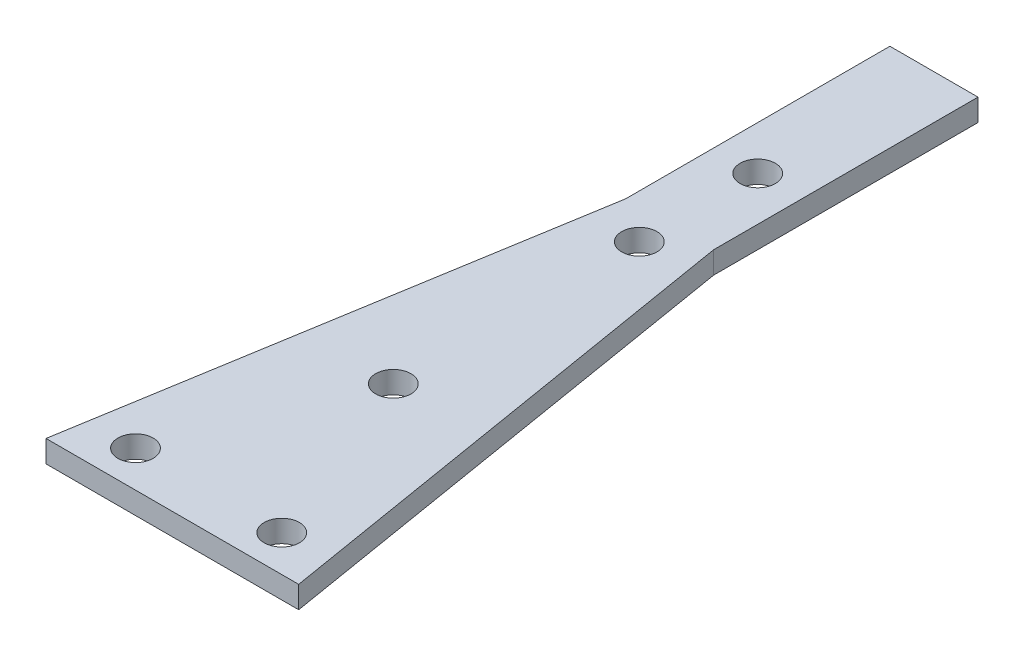
ISO-10303-21;
HEADER;
FILE_DESCRIPTION(('STEP AP214'),'2;1');
FILE_NAME('part.step','',(''),(''),'','','');
FILE_SCHEMA(('AUTOMOTIVE_DESIGN { 1 0 10303 214 1 1 1 1 }'));
ENDSEC;
DATA;
#1=APPLICATION_CONTEXT('core data for automotive mechanical design processes');
#2=APPLICATION_PROTOCOL_DEFINITION('international standard','automotive_design',2000,#1);
#3=PRODUCT_CONTEXT('',#1,'mechanical');
#4=PRODUCT('Part','Part','',(#3));
#5=PRODUCT_RELATED_PRODUCT_CATEGORY('part','',(#4));
#6=PRODUCT_DEFINITION_FORMATION('','',#4);
#7=PRODUCT_DEFINITION_CONTEXT('part definition',#1,'design');
#8=PRODUCT_DEFINITION('design','',#6,#7);
#9=PRODUCT_DEFINITION_SHAPE('','',#8);
#10=(LENGTH_UNIT() NAMED_UNIT(*) SI_UNIT(.MILLI.,.METRE.));
#11=(NAMED_UNIT(*) PLANE_ANGLE_UNIT() SI_UNIT($,.RADIAN.));
#12=(NAMED_UNIT(*) SI_UNIT($,.STERADIAN.) SOLID_ANGLE_UNIT());
#13=UNCERTAINTY_MEASURE_WITH_UNIT(LENGTH_MEASURE(1.E-05),#10,'distance_accuracy_value','');
#14=(GEOMETRIC_REPRESENTATION_CONTEXT(3) GLOBAL_UNCERTAINTY_ASSIGNED_CONTEXT((#13)) GLOBAL_UNIT_ASSIGNED_CONTEXT((#10,
#11,#12)) REPRESENTATION_CONTEXT('',''));
#15=CARTESIAN_POINT('',(0.,0.,0.));
#16=DIRECTION('',(0.,0.,1.));
#17=DIRECTION('',(1.,0.,0.));
#18=AXIS2_PLACEMENT_3D('',#15,#16,#17);
#19=CARTESIAN_POINT('',(0.,3.175,-5.08));
#20=DIRECTION('',(0.,0.,1.));
#21=DIRECTION('',(1.,0.,0.));
#22=AXIS2_PLACEMENT_3D('',#19,#20,#21);
#23=PLANE('',#22);
#24=DIRECTION('',(-1.,0.,0.));
#25=VECTOR('',#24,1.);
#26=CARTESIAN_POINT('',(0.,0.,-5.08));
#27=LINE('',#26,#25);
#28=CARTESIAN_POINT('',(37.2594043022615,0.,-5.08));
#29=VERTEX_POINT('',#28);
#30=CARTESIAN_POINT('',(0.840595697738554,0.,-5.08));
#31=VERTEX_POINT('',#30);
#32=EDGE_CURVE('E147',#29,#31,#27,.T.);
#33=ORIENTED_EDGE('',*,*,#32,.F.);
#34=DIRECTION('',(0.,-1.,0.));
#35=VECTOR('',#34,1.);
#36=CARTESIAN_POINT('',(37.2594043022615,3.175,-5.08));
#37=LINE('',#36,#35);
#38=CARTESIAN_POINT('',(37.2594043022615,3.175,-5.08));
#39=VERTEX_POINT('',#38);
#40=EDGE_CURVE('E11',#39,#29,#37,.T.);
#41=ORIENTED_EDGE('',*,*,#40,.F.);
#42=DIRECTION('',(-1.,0.,0.));
#43=VECTOR('',#42,1.);
#44=CARTESIAN_POINT('',(0.,3.175,-5.08));
#45=LINE('',#44,#43);
#46=CARTESIAN_POINT('',(0.840595697738554,3.175,-5.08));
#47=VERTEX_POINT('',#46);
#48=EDGE_CURVE('E185',#39,#47,#45,.T.);
#49=ORIENTED_EDGE('',*,*,#48,.T.);
#50=DIRECTION('',(0.,-1.,0.));
#51=VECTOR('',#50,1.);
#52=CARTESIAN_POINT('',(0.840595697738554,3.175,-5.08));
#53=LINE('',#52,#51);
#54=EDGE_CURVE('E93',#47,#31,#53,.T.);
#55=ORIENTED_EDGE('',*,*,#54,.T.);
#56=EDGE_LOOP('',(#33,#41,#49,#55));
#57=FACE_BOUND('',#56,.T.);
#58=ADVANCED_FACE('F47',(#57),#23,.T.);
#59=CARTESIAN_POINT('',(37.0845923963175,3.175,-6.13644661825443));
#60=DIRECTION('',(0.986584452438366,0.,-0.163251702003039));
#61=DIRECTION('',(-0.163251702003039,0.,-0.986584452438366));
#62=AXIS2_PLACEMENT_3D('',#59,#60,#61);
#63=PLANE('',#62);
#64=DIRECTION('',(0.163251702003039,0.,0.986584452438366));
#65=VECTOR('',#64,1.);
#66=CARTESIAN_POINT('',(37.0845923963175,0.,-6.13644661825443));
#67=LINE('',#66,#65);
#68=CARTESIAN_POINT('',(25.4,0.,-76.7503333333334));
#69=VERTEX_POINT('',#68);
#70=EDGE_CURVE('E151',#69,#29,#67,.T.);
#71=ORIENTED_EDGE('',*,*,#70,.F.);
#72=DIRECTION('',(0.,-1.,0.));
#73=VECTOR('',#72,1.);
#74=CARTESIAN_POINT('',(25.4,3.175,-76.7503333333334));
#75=LINE('',#74,#73);
#76=CARTESIAN_POINT('',(25.4,3.175,-76.7503333333334));
#77=VERTEX_POINT('',#76);
#78=EDGE_CURVE('E57',#77,#69,#75,.T.);
#79=ORIENTED_EDGE('',*,*,#78,.F.);
#80=DIRECTION('',(0.163251702003039,0.,0.986584452438366));
#81=VECTOR('',#80,1.);
#82=CARTESIAN_POINT('',(37.0845923963175,3.175,-6.13644661825443));
#83=LINE('',#82,#81);
#84=EDGE_CURVE('E183',#77,#39,#83,.T.);
#85=ORIENTED_EDGE('',*,*,#84,.T.);
#86=ORIENTED_EDGE('',*,*,#40,.T.);
#87=EDGE_LOOP('',(#71,#79,#85,#86));
#88=FACE_BOUND('',#87,.T.);
#89=ADVANCED_FACE('F182',(#88),#63,.T.);
#90=CARTESIAN_POINT('',(25.4,3.175,0.));
#91=DIRECTION('',(-1.,0.,0.));
#92=DIRECTION('',(0.,0.,1.));
#93=AXIS2_PLACEMENT_3D('',#90,#91,#92);
#94=PLANE('',#93);
#95=DIRECTION('',(0.,0.,-1.));
#96=VECTOR('',#95,1.);
#97=CARTESIAN_POINT('',(25.4,0.,0.));
#98=LINE('',#97,#96);
#99=CARTESIAN_POINT('',(25.4,0.,-114.850333333333));
#100=VERTEX_POINT('',#99);
#101=EDGE_CURVE('E155',#69,#100,#98,.T.);
#102=ORIENTED_EDGE('',*,*,#101,.T.);
#103=DIRECTION('',(0.,-1.,0.));
#104=VECTOR('',#103,1.);
#105=CARTESIAN_POINT('',(25.4,3.175,-114.850333333333));
#106=LINE('',#105,#104);
#107=CARTESIAN_POINT('',(25.4,3.175,-114.850333333333));
#108=VERTEX_POINT('',#107);
#109=EDGE_CURVE('E117',#108,#100,#106,.T.);
#110=ORIENTED_EDGE('',*,*,#109,.F.);
#111=DIRECTION('',(0.,0.,-1.));
#112=VECTOR('',#111,1.);
#113=CARTESIAN_POINT('',(25.4,3.175,0.));
#114=LINE('',#113,#112);
#115=EDGE_CURVE('E123',#77,#108,#114,.T.);
#116=ORIENTED_EDGE('',*,*,#115,.F.);
#117=ORIENTED_EDGE('',*,*,#78,.T.);
#118=EDGE_LOOP('',(#102,#110,#116,#117));
#119=FACE_BOUND('',#118,.T.);
#120=ADVANCED_FACE('F176',(#119),#94,.F.);
#121=CARTESIAN_POINT('',(0.,3.175,-114.850333333333));
#122=DIRECTION('',(0.,0.,-1.));
#123=DIRECTION('',(-1.,0.,0.));
#124=AXIS2_PLACEMENT_3D('',#121,#122,#123);
#125=PLANE('',#124);
#126=DIRECTION('',(1.,0.,0.));
#127=VECTOR('',#126,1.);
#128=CARTESIAN_POINT('',(0.,0.,-114.850333333333));
#129=LINE('',#128,#127);
#130=CARTESIAN_POINT('',(12.7,0.,-114.850333333333));
#131=VERTEX_POINT('',#130);
#132=EDGE_CURVE('E111',#131,#100,#129,.T.);
#133=ORIENTED_EDGE('',*,*,#132,.F.);
#134=DIRECTION('',(0.,-1.,0.));
#135=VECTOR('',#134,1.);
#136=CARTESIAN_POINT('',(12.7,3.175,-114.850333333333));
#137=LINE('',#136,#135);
#138=CARTESIAN_POINT('',(12.7,3.175,-114.850333333333));
#139=VERTEX_POINT('',#138);
#140=EDGE_CURVE('E106',#139,#131,#137,.T.);
#141=ORIENTED_EDGE('',*,*,#140,.F.);
#142=DIRECTION('',(1.,0.,0.));
#143=VECTOR('',#142,1.);
#144=CARTESIAN_POINT('',(0.,3.175,-114.850333333333));
#145=LINE('',#144,#143);
#146=EDGE_CURVE('E109',#139,#108,#145,.T.);
#147=ORIENTED_EDGE('',*,*,#146,.T.);
#148=ORIENTED_EDGE('',*,*,#109,.T.);
#149=EDGE_LOOP('',(#133,#141,#147,#148));
#150=FACE_BOUND('',#149,.T.);
#151=ADVANCED_FACE('F108',(#150),#125,.T.);
#152=CARTESIAN_POINT('',(12.7,3.175,0.));
#153=DIRECTION('',(-1.,0.,0.));
#154=DIRECTION('',(0.,0.,1.));
#155=AXIS2_PLACEMENT_3D('',#152,#153,#154);
#156=PLANE('',#155);
#157=DIRECTION('',(0.,0.,-1.));
#158=VECTOR('',#157,1.);
#159=CARTESIAN_POINT('',(12.7,0.,0.));
#160=LINE('',#159,#158);
#161=CARTESIAN_POINT('',(12.7,0.,-76.7503333333334));
#162=VERTEX_POINT('',#161);
#163=EDGE_CURVE('E161',#162,#131,#160,.T.);
#164=ORIENTED_EDGE('',*,*,#163,.F.);
#165=DIRECTION('',(0.,-1.,0.));
#166=VECTOR('',#165,1.);
#167=CARTESIAN_POINT('',(12.7,3.175,-76.7503333333334));
#168=LINE('',#167,#166);
#169=CARTESIAN_POINT('',(12.7,3.175,-76.7503333333334));
#170=VERTEX_POINT('',#169);
#171=EDGE_CURVE('E86',#170,#162,#168,.T.);
#172=ORIENTED_EDGE('',*,*,#171,.F.);
#173=DIRECTION('',(0.,0.,-1.));
#174=VECTOR('',#173,1.);
#175=CARTESIAN_POINT('',(12.7,3.175,0.));
#176=LINE('',#175,#174);
#177=EDGE_CURVE('E120',#170,#139,#176,.T.);
#178=ORIENTED_EDGE('',*,*,#177,.T.);
#179=ORIENTED_EDGE('',*,*,#140,.T.);
#180=EDGE_LOOP('',(#164,#172,#178,#179));
#181=FACE_BOUND('',#180,.T.);
#182=ADVANCED_FACE('F127',(#181),#156,.T.);
#183=CARTESIAN_POINT('',(8.509,3.175,-10.3124));
#184=DIRECTION('',(0.,-1.,0.));
#185=DIRECTION('',(0.,0.,-1.));
#186=AXIS2_PLACEMENT_3D('',#183,#184,#185);
#187=CYLINDRICAL_SURFACE('',#186,2.54);
#188=CARTESIAN_POINT('',(8.509,3.175,-10.3124));
#189=DIRECTION('',(0.,1.,0.));
#190=DIRECTION('',(0.,0.,1.));
#191=AXIS2_PLACEMENT_3D('',#188,#189,#190);
#192=CIRCLE('',#191,2.54);
#193=CARTESIAN_POINT('',(8.509,3.175,-7.7724));
#194=VERTEX_POINT('',#193);
#195=EDGE_CURVE('E187',#194,#194,#192,.T.);
#196=ORIENTED_EDGE('',*,*,#195,.T.);
#197=EDGE_LOOP('',(#196));
#198=FACE_BOUND('',#197,.T.);
#199=CARTESIAN_POINT('',(8.509,0.,-10.3124));
#200=DIRECTION('',(0.,1.,0.));
#201=DIRECTION('',(0.,0.,1.));
#202=AXIS2_PLACEMENT_3D('',#199,#200,#201);
#203=CIRCLE('',#202,2.54);
#204=CARTESIAN_POINT('',(8.509,0.,-7.7724));
#205=VERTEX_POINT('',#204);
#206=EDGE_CURVE('E143',#205,#205,#203,.T.);
#207=ORIENTED_EDGE('',*,*,#206,.F.);
#208=EDGE_LOOP('',(#207));
#209=FACE_BOUND('',#208,.T.);
#210=ADVANCED_FACE('F233',(#198,#209),#187,.F.);
#211=CARTESIAN_POINT('',(29.591,3.175,-10.3124));
#212=DIRECTION('',(0.,-1.,0.));
#213=DIRECTION('',(0.,0.,-1.));
#214=AXIS2_PLACEMENT_3D('',#211,#212,#213);
#215=CYLINDRICAL_SURFACE('',#214,2.54);
#216=CARTESIAN_POINT('',(29.591,3.175,-10.3124));
#217=DIRECTION('',(0.,1.,0.));
#218=DIRECTION('',(0.,0.,1.));
#219=AXIS2_PLACEMENT_3D('',#216,#217,#218);
#220=CIRCLE('',#219,2.54);
#221=CARTESIAN_POINT('',(29.591,3.175,-7.7724));
#222=VERTEX_POINT('',#221);
#223=EDGE_CURVE('E193',#222,#222,#220,.T.);
#224=ORIENTED_EDGE('',*,*,#223,.T.);
#225=EDGE_LOOP('',(#224));
#226=FACE_BOUND('',#225,.T.);
#227=CARTESIAN_POINT('',(29.591,0.,-10.3124));
#228=DIRECTION('',(0.,1.,0.));
#229=DIRECTION('',(0.,0.,1.));
#230=AXIS2_PLACEMENT_3D('',#227,#228,#229);
#231=CIRCLE('',#230,2.54);
#232=CARTESIAN_POINT('',(29.591,0.,-7.7724));
#233=VERTEX_POINT('',#232);
#234=EDGE_CURVE('E138',#233,#233,#231,.T.);
#235=ORIENTED_EDGE('',*,*,#234,.F.);
#236=EDGE_LOOP('',(#235));
#237=FACE_BOUND('',#236,.T.);
#238=ADVANCED_FACE('F235',(#226,#237),#215,.F.);
#239=CARTESIAN_POINT('',(19.05,3.175,-36.9316));
#240=DIRECTION('',(0.,-1.,0.));
#241=DIRECTION('',(0.,0.,-1.));
#242=AXIS2_PLACEMENT_3D('',#239,#240,#241);
#243=CYLINDRICAL_SURFACE('',#242,2.54);
#244=CARTESIAN_POINT('',(19.05,3.175,-36.9316));
#245=DIRECTION('',(0.,1.,0.));
#246=DIRECTION('',(0.,0.,1.));
#247=AXIS2_PLACEMENT_3D('',#244,#245,#246);
#248=CIRCLE('',#247,2.54);
#249=CARTESIAN_POINT('',(19.05,3.175,-34.3916));
#250=VERTEX_POINT('',#249);
#251=EDGE_CURVE('E167',#250,#250,#248,.T.);
#252=ORIENTED_EDGE('',*,*,#251,.T.);
#253=EDGE_LOOP('',(#252));
#254=FACE_BOUND('',#253,.T.);
#255=CARTESIAN_POINT('',(19.05,0.,-36.9316));
#256=DIRECTION('',(0.,1.,0.));
#257=DIRECTION('',(0.,0.,1.));
#258=AXIS2_PLACEMENT_3D('',#255,#256,#257);
#259=CIRCLE('',#258,2.54);
#260=CARTESIAN_POINT('',(19.05,0.,-34.3916));
#261=VERTEX_POINT('',#260);
#262=EDGE_CURVE('E134',#261,#261,#259,.T.);
#263=ORIENTED_EDGE('',*,*,#262,.F.);
#264=EDGE_LOOP('',(#263));
#265=FACE_BOUND('',#264,.T.);
#266=ADVANCED_FACE('F49',(#254,#265),#243,.F.);
#267=CARTESIAN_POINT('',(0.,3.175,0.));
#268=DIRECTION('',(0.986584452438366,0.,0.163251702003039));
#269=DIRECTION('',(0.163251702003039,0.,-0.986584452438366));
#270=AXIS2_PLACEMENT_3D('',#267,#268,#269);
#271=PLANE('',#270);
#272=DIRECTION('',(-0.163251702003039,0.,0.986584452438366));
#273=VECTOR('',#272,1.);
#274=CARTESIAN_POINT('',(0.,0.,0.));
#275=LINE('',#274,#273);
#276=EDGE_CURVE('E164',#162,#31,#275,.T.);
#277=ORIENTED_EDGE('',*,*,#276,.T.);
#278=ORIENTED_EDGE('',*,*,#54,.F.);
#279=DIRECTION('',(-0.163251702003039,0.,0.986584452438366));
#280=VECTOR('',#279,1.);
#281=CARTESIAN_POINT('',(0.,3.175,0.));
#282=LINE('',#281,#280);
#283=EDGE_CURVE('E65',#170,#47,#282,.T.);
#284=ORIENTED_EDGE('',*,*,#283,.F.);
#285=ORIENTED_EDGE('',*,*,#171,.T.);
#286=EDGE_LOOP('',(#277,#278,#284,#285));
#287=FACE_BOUND('',#286,.T.);
#288=ADVANCED_FACE('F184',(#287),#271,.F.);
#289=CARTESIAN_POINT('',(0.,3.175,0.));
#290=DIRECTION('',(0.,1.,0.));
#291=DIRECTION('',(0.,0.,1.));
#292=AXIS2_PLACEMENT_3D('',#289,#290,#291);
#293=PLANE('',#292);
#294=CARTESIAN_POINT('',(19.05,3.175,-72.39));
#295=DIRECTION('',(0.,1.,0.));
#296=DIRECTION('',(0.,0.,1.));
#297=AXIS2_PLACEMENT_3D('',#294,#295,#296);
#298=CIRCLE('',#297,2.54);
#299=CARTESIAN_POINT('',(19.05,3.175,-69.85));
#300=VERTEX_POINT('',#299);
#301=EDGE_CURVE('E139',#300,#300,#298,.T.);
#302=ORIENTED_EDGE('',*,*,#301,.F.);
#303=EDGE_LOOP('',(#302));
#304=FACE_BOUND('',#303,.T.);
#305=CARTESIAN_POINT('',(19.05,3.175,-89.4503333333333));
#306=DIRECTION('',(0.,1.,0.));
#307=DIRECTION('',(0.,0.,1.));
#308=AXIS2_PLACEMENT_3D('',#305,#306,#307);
#309=CIRCLE('',#308,2.54);
#310=CARTESIAN_POINT('',(19.05,3.175,-86.9103333333334));
#311=VERTEX_POINT('',#310);
#312=EDGE_CURVE('E206',#311,#311,#309,.T.);
#313=ORIENTED_EDGE('',*,*,#312,.F.);
#314=EDGE_LOOP('',(#313));
#315=FACE_BOUND('',#314,.T.);
#316=ORIENTED_EDGE('',*,*,#251,.F.);
#317=EDGE_LOOP('',(#316));
#318=FACE_BOUND('',#317,.T.);
#319=ORIENTED_EDGE('',*,*,#223,.F.);
#320=EDGE_LOOP('',(#319));
#321=FACE_BOUND('',#320,.T.);
#322=ORIENTED_EDGE('',*,*,#195,.F.);
#323=EDGE_LOOP('',(#322));
#324=FACE_BOUND('',#323,.T.);
#325=ORIENTED_EDGE('',*,*,#48,.F.);
#326=ORIENTED_EDGE('',*,*,#84,.F.);
#327=ORIENTED_EDGE('',*,*,#115,.T.);
#328=ORIENTED_EDGE('',*,*,#146,.F.);
#329=ORIENTED_EDGE('',*,*,#177,.F.);
#330=ORIENTED_EDGE('',*,*,#283,.T.);
#331=EDGE_LOOP('',(#325,#326,#327,#328,#329,#330));
#332=FACE_BOUND('',#331,.T.);
#333=ADVANCED_FACE('F119',(#304,#315,#318,#321,#324,#332),#293,.T.);
#334=CARTESIAN_POINT('',(0.,0.,0.));
#335=DIRECTION('',(0.,1.,0.));
#336=DIRECTION('',(0.,0.,1.));
#337=AXIS2_PLACEMENT_3D('',#334,#335,#336);
#338=PLANE('',#337);
#339=CARTESIAN_POINT('',(19.05,0.,-72.39));
#340=DIRECTION('',(0.,-1.,0.));
#341=DIRECTION('',(0.,0.,-1.));
#342=AXIS2_PLACEMENT_3D('',#339,#340,#341);
#343=CIRCLE('',#342,2.54);
#344=CARTESIAN_POINT('',(19.05,0.,-74.93));
#345=VERTEX_POINT('',#344);
#346=EDGE_CURVE('E210',#345,#345,#343,.T.);
#347=ORIENTED_EDGE('',*,*,#346,.F.);
#348=EDGE_LOOP('',(#347));
#349=FACE_BOUND('',#348,.T.);
#350=CARTESIAN_POINT('',(19.05,0.,-89.4503333333333));
#351=DIRECTION('',(0.,-1.,0.));
#352=DIRECTION('',(0.,0.,-1.));
#353=AXIS2_PLACEMENT_3D('',#350,#351,#352);
#354=CIRCLE('',#353,2.54);
#355=CARTESIAN_POINT('',(19.05,0.,-91.9903333333334));
#356=VERTEX_POINT('',#355);
#357=EDGE_CURVE('E211',#356,#356,#354,.T.);
#358=ORIENTED_EDGE('',*,*,#357,.F.);
#359=EDGE_LOOP('',(#358));
#360=FACE_BOUND('',#359,.T.);
#361=ORIENTED_EDGE('',*,*,#262,.T.);
#362=EDGE_LOOP('',(#361));
#363=FACE_BOUND('',#362,.T.);
#364=ORIENTED_EDGE('',*,*,#234,.T.);
#365=EDGE_LOOP('',(#364));
#366=FACE_BOUND('',#365,.T.);
#367=ORIENTED_EDGE('',*,*,#206,.T.);
#368=EDGE_LOOP('',(#367));
#369=FACE_BOUND('',#368,.T.);
#370=ORIENTED_EDGE('',*,*,#32,.T.);
#371=ORIENTED_EDGE('',*,*,#276,.F.);
#372=ORIENTED_EDGE('',*,*,#163,.T.);
#373=ORIENTED_EDGE('',*,*,#132,.T.);
#374=ORIENTED_EDGE('',*,*,#101,.F.);
#375=ORIENTED_EDGE('',*,*,#70,.T.);
#376=EDGE_LOOP('',(#370,#371,#372,#373,#374,#375));
#377=FACE_BOUND('',#376,.T.);
#378=ADVANCED_FACE('F181',(#349,#360,#363,#366,#369,#377),#338,.F.);
#379=CARTESIAN_POINT('',(19.05,25.4,-89.4503333333333));
#380=DIRECTION('',(0.,-1.,0.));
#381=DIRECTION('',(0.,0.,-1.));
#382=AXIS2_PLACEMENT_3D('',#379,#380,#381);
#383=CYLINDRICAL_SURFACE('',#382,2.54);
#384=ORIENTED_EDGE('',*,*,#312,.T.);
#385=EDGE_LOOP('',(#384));
#386=FACE_BOUND('',#385,.T.);
#387=ORIENTED_EDGE('',*,*,#357,.T.);
#388=EDGE_LOOP('',(#387));
#389=FACE_BOUND('',#388,.T.);
#390=ADVANCED_FACE('F223',(#386,#389),#383,.F.);
#391=CARTESIAN_POINT('',(19.05,25.4,-72.39));
#392=DIRECTION('',(0.,-1.,0.));
#393=DIRECTION('',(0.,0.,-1.));
#394=AXIS2_PLACEMENT_3D('',#391,#392,#393);
#395=CYLINDRICAL_SURFACE('',#394,2.54);
#396=ORIENTED_EDGE('',*,*,#301,.T.);
#397=EDGE_LOOP('',(#396));
#398=FACE_BOUND('',#397,.T.);
#399=ORIENTED_EDGE('',*,*,#346,.T.);
#400=EDGE_LOOP('',(#399));
#401=FACE_BOUND('',#400,.T.);
#402=ADVANCED_FACE('F219',(#398,#401),#395,.F.);
#403=CLOSED_SHELL('',(#58,#89,#120,#151,#182,#210,#238,#266,#288,#333,#378,#390,#402));
#404=MANIFOLD_SOLID_BREP('B2',#403);
#405=ADVANCED_BREP_SHAPE_REPRESENTATION('',(#18,#404),#14);
#406=SHAPE_DEFINITION_REPRESENTATION(#9,#405);
ENDSEC;
END-ISO-10303-21;
